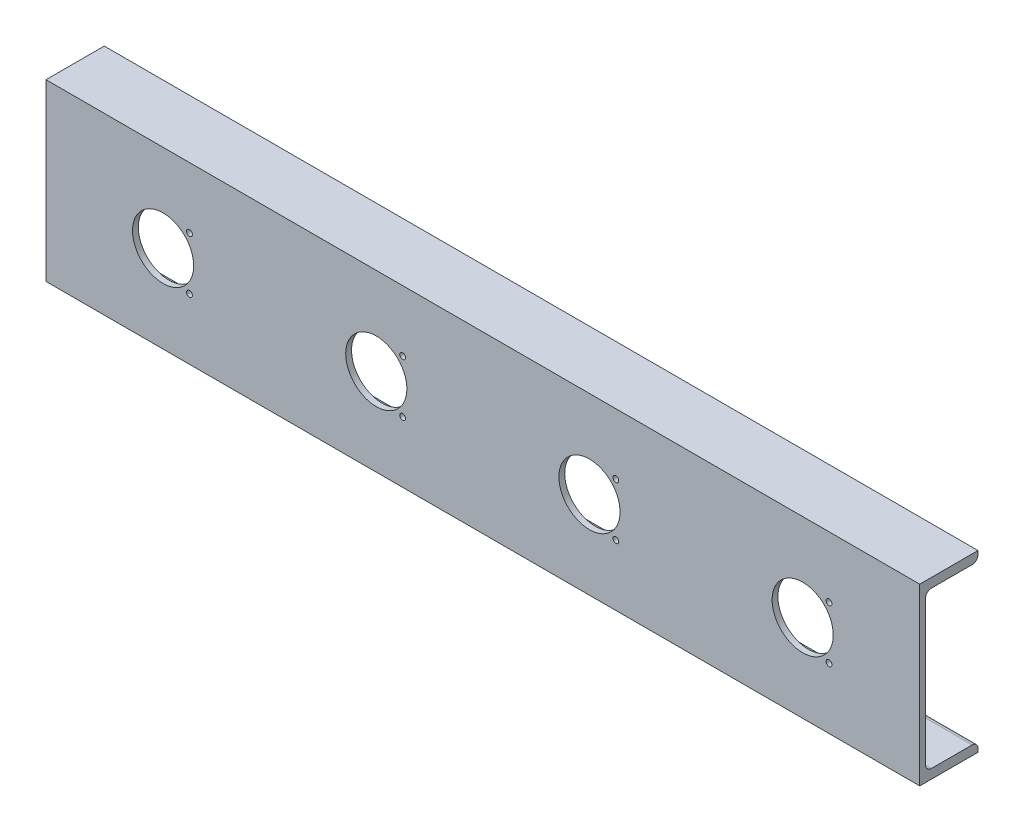
ISO-10303-21;
HEADER;
FILE_DESCRIPTION(('STEP AP214'),'2;1');
FILE_NAME('part.step','',(''),(''),'','','');
FILE_SCHEMA(('AUTOMOTIVE_DESIGN { 1 0 10303 214 1 1 1 1 }'));
ENDSEC;
DATA;
#1=APPLICATION_CONTEXT('core data for automotive mechanical design processes');
#2=APPLICATION_PROTOCOL_DEFINITION('international standard','automotive_design',2000,#1);
#3=PRODUCT_CONTEXT('',#1,'mechanical');
#4=PRODUCT('Part','Part','',(#3));
#5=PRODUCT_RELATED_PRODUCT_CATEGORY('part','',(#4));
#6=PRODUCT_DEFINITION_FORMATION('','',#4);
#7=PRODUCT_DEFINITION_CONTEXT('part definition',#1,'design');
#8=PRODUCT_DEFINITION('design','',#6,#7);
#9=PRODUCT_DEFINITION_SHAPE('','',#8);
#10=(LENGTH_UNIT() NAMED_UNIT(*) SI_UNIT(.MILLI.,.METRE.));
#11=(NAMED_UNIT(*) PLANE_ANGLE_UNIT() SI_UNIT($,.RADIAN.));
#12=(NAMED_UNIT(*) SI_UNIT($,.STERADIAN.) SOLID_ANGLE_UNIT());
#13=UNCERTAINTY_MEASURE_WITH_UNIT(LENGTH_MEASURE(1.E-05),#10,'distance_accuracy_value','');
#14=(GEOMETRIC_REPRESENTATION_CONTEXT(3) GLOBAL_UNCERTAINTY_ASSIGNED_CONTEXT((#13)) GLOBAL_UNIT_ASSIGNED_CONTEXT((#10,
#11,#12)) REPRESENTATION_CONTEXT('',''));
#15=CARTESIAN_POINT('',(0.,0.,0.));
#16=DIRECTION('',(0.,0.,1.));
#17=DIRECTION('',(1.,0.,0.));
#18=AXIS2_PLACEMENT_3D('',#15,#16,#17);
#19=CARTESIAN_POINT('',(201.,-36.1204013377926,206.622073578595));
#20=DIRECTION('',(0.,0.,-1.));
#21=DIRECTION('',(0.,1.,0.));
#22=AXIS2_PLACEMENT_3D('',#19,#20,#21);
#23=CYLINDRICAL_SURFACE('',#22,52.4999999999999);
#24=CARTESIAN_POINT('',(201.,-36.1204013377926,176.622073578595));
#25=DIRECTION('',(0.,0.,-1.));
#26=DIRECTION('',(0.,1.,0.));
#27=AXIS2_PLACEMENT_3D('',#24,#25,#26);
#28=CIRCLE('',#27,52.4999999999999);
#29=CARTESIAN_POINT('',(201.,16.3795986622073,176.622073578595));
#30=VERTEX_POINT('',#29);
#31=EDGE_CURVE('E43',#30,#30,#28,.T.);
#32=ORIENTED_EDGE('',*,*,#31,.T.);
#33=EDGE_LOOP('',(#32));
#34=FACE_BOUND('',#33,.T.);
#35=CARTESIAN_POINT('',(201.,-36.1204013377926,186.622073578595));
#36=DIRECTION('',(0.,0.,-1.));
#37=DIRECTION('',(-1.,0.,0.));
#38=AXIS2_PLACEMENT_3D('',#35,#36,#37);
#39=CIRCLE('',#38,52.4999999999999);
#40=CARTESIAN_POINT('',(148.5,-36.1204013377926,186.622073578595));
#41=VERTEX_POINT('',#40);
#42=EDGE_CURVE('E11',#41,#41,#39,.T.);
#43=ORIENTED_EDGE('',*,*,#42,.F.);
#44=EDGE_LOOP('',(#43));
#45=FACE_BOUND('',#44,.T.);
#46=ADVANCED_FACE('F34',(#34,#45),#23,.F.);
#47=CARTESIAN_POINT('',(567.,-36.1204013377926,206.622073578595));
#48=DIRECTION('',(0.,0.,-1.));
#49=DIRECTION('',(0.,1.,0.));
#50=AXIS2_PLACEMENT_3D('',#47,#48,#49);
#51=CYLINDRICAL_SURFACE('',#50,52.4999999999999);
#52=CARTESIAN_POINT('',(567.,-36.1204013377926,176.622073578595));
#53=DIRECTION('',(0.,0.,-1.));
#54=DIRECTION('',(0.,1.,0.));
#55=AXIS2_PLACEMENT_3D('',#52,#53,#54);
#56=CIRCLE('',#55,52.4999999999999);
#57=CARTESIAN_POINT('',(567.,16.3795986622073,176.622073578595));
#58=VERTEX_POINT('',#57);
#59=EDGE_CURVE('E207',#58,#58,#56,.T.);
#60=ORIENTED_EDGE('',*,*,#59,.T.);
#61=EDGE_LOOP('',(#60));
#62=FACE_BOUND('',#61,.T.);
#63=CARTESIAN_POINT('',(567.,-36.1204013377926,186.622073578595));
#64=DIRECTION('',(0.,0.,-1.));
#65=DIRECTION('',(-1.,0.,0.));
#66=AXIS2_PLACEMENT_3D('',#63,#64,#65);
#67=CIRCLE('',#66,52.4999999999999);
#68=CARTESIAN_POINT('',(514.5,-36.1204013377926,186.622073578595));
#69=VERTEX_POINT('',#68);
#70=EDGE_CURVE('E210',#69,#69,#67,.T.);
#71=ORIENTED_EDGE('',*,*,#70,.F.);
#72=EDGE_LOOP('',(#71));
#73=FACE_BOUND('',#72,.T.);
#74=ADVANCED_FACE('F313',(#62,#73),#51,.F.);
#75=CARTESIAN_POINT('',(1500.,107.879598662207,86.6220735785954));
#76=DIRECTION('',(0.,0.,1.));
#77=DIRECTION('',(1.,0.,0.));
#78=AXIS2_PLACEMENT_3D('',#75,#76,#77);
#79=PLANE('',#78);
#80=DIRECTION('',(0.,1.,0.));
#81=VECTOR('',#80,1.);
#82=CARTESIAN_POINT('',(0.,107.879598662207,86.6220735785954));
#83=LINE('',#82,#81);
#84=CARTESIAN_POINT('',(0.,107.879598662207,86.6220735785954));
#85=VERTEX_POINT('',#84);
#86=CARTESIAN_POINT('',(0.,113.879598662207,86.6220735785954));
#87=VERTEX_POINT('',#86);
#88=EDGE_CURVE('E157',#85,#87,#83,.T.);
#89=ORIENTED_EDGE('',*,*,#88,.T.);
#90=DIRECTION('',(-1.,0.,0.));
#91=VECTOR('',#90,1.);
#92=CARTESIAN_POINT('',(1500.,113.879598662207,86.6220735785954));
#93=LINE('',#92,#91);
#94=CARTESIAN_POINT('',(1500.,113.879598662207,86.6220735785954));
#95=VERTEX_POINT('',#94);
#96=EDGE_CURVE('E205',#95,#87,#93,.T.);
#97=ORIENTED_EDGE('',*,*,#96,.F.);
#98=DIRECTION('',(0.,1.,0.));
#99=VECTOR('',#98,1.);
#100=CARTESIAN_POINT('',(1500.,107.879598662207,86.6220735785954));
#101=LINE('',#100,#99);
#102=CARTESIAN_POINT('',(1500.,107.879598662207,86.6220735785954));
#103=VERTEX_POINT('',#102);
#104=EDGE_CURVE('E180',#103,#95,#101,.T.);
#105=ORIENTED_EDGE('',*,*,#104,.F.);
#106=DIRECTION('',(-1.,0.,0.));
#107=VECTOR('',#106,1.);
#108=CARTESIAN_POINT('',(1500.,107.879598662207,86.6220735785954));
#109=LINE('',#108,#107);
#110=EDGE_CURVE('E153',#103,#85,#109,.T.);
#111=ORIENTED_EDGE('',*,*,#110,.T.);
#112=EDGE_LOOP('',(#89,#97,#105,#111));
#113=FACE_BOUND('',#112,.T.);
#114=ADVANCED_FACE('F300',(#113),#79,.F.);
#115=CARTESIAN_POINT('',(1500.,113.879598662207,86.6220735785954));
#116=DIRECTION('',(0.,-1.,0.));
#117=DIRECTION('',(0.,0.,-1.));
#118=AXIS2_PLACEMENT_3D('',#115,#116,#117);
#119=PLANE('',#118);
#120=DIRECTION('',(0.,0.,1.));
#121=VECTOR('',#120,1.);
#122=CARTESIAN_POINT('',(0.,113.879598662207,86.6220735785954));
#123=LINE('',#122,#121);
#124=CARTESIAN_POINT('',(0.,113.879598662207,186.622073578595));
#125=VERTEX_POINT('',#124);
#126=EDGE_CURVE('E160',#87,#125,#123,.T.);
#127=ORIENTED_EDGE('',*,*,#126,.T.);
#128=DIRECTION('',(-1.,0.,0.));
#129=VECTOR('',#128,1.);
#130=CARTESIAN_POINT('',(1500.,113.879598662207,186.622073578595));
#131=LINE('',#130,#129);
#132=CARTESIAN_POINT('',(1500.,113.879598662207,186.622073578595));
#133=VERTEX_POINT('',#132);
#134=EDGE_CURVE('E202',#133,#125,#131,.T.);
#135=ORIENTED_EDGE('',*,*,#134,.F.);
#136=DIRECTION('',(0.,0.,1.));
#137=VECTOR('',#136,1.);
#138=CARTESIAN_POINT('',(1500.,113.879598662207,86.6220735785954));
#139=LINE('',#138,#137);
#140=EDGE_CURVE('E108',#95,#133,#139,.T.);
#141=ORIENTED_EDGE('',*,*,#140,.F.);
#142=ORIENTED_EDGE('',*,*,#96,.T.);
#143=EDGE_LOOP('',(#127,#135,#141,#142));
#144=FACE_BOUND('',#143,.T.);
#145=ADVANCED_FACE('F326',(#144),#119,.F.);
#146=CARTESIAN_POINT('',(1500.,113.879598662207,186.622073578595));
#147=DIRECTION('',(0.,0.,-1.));
#148=DIRECTION('',(-1.,0.,0.));
#149=AXIS2_PLACEMENT_3D('',#146,#147,#148);
#150=PLANE('',#149);
#151=CARTESIAN_POINT('',(246.254833995939,9.13443265814651,186.622073578595));
#152=DIRECTION('',(0.,0.,-1.));
#153=DIRECTION('',(-1.,0.,0.));
#154=AXIS2_PLACEMENT_3D('',#151,#152,#153);
#155=CIRCLE('',#154,4.99999999999982);
#156=CARTESIAN_POINT('',(241.254833995939,9.13443265814651,186.622073578595));
#157=VERTEX_POINT('',#156);
#158=EDGE_CURVE('E219',#157,#157,#155,.T.);
#159=ORIENTED_EDGE('',*,*,#158,.T.);
#160=EDGE_LOOP('',(#159));
#161=FACE_BOUND('',#160,.T.);
#162=CARTESIAN_POINT('',(612.254833995939,-81.3752353337317,186.622073578595));
#163=DIRECTION('',(0.,0.,-1.));
#164=DIRECTION('',(-1.,0.,0.));
#165=AXIS2_PLACEMENT_3D('',#162,#163,#164);
#166=CIRCLE('',#165,4.99999999999982);
#167=CARTESIAN_POINT('',(607.254833995939,-81.3752353337317,186.622073578595));
#168=VERTEX_POINT('',#167);
#169=EDGE_CURVE('E241',#168,#168,#166,.T.);
#170=ORIENTED_EDGE('',*,*,#169,.T.);
#171=EDGE_LOOP('',(#170));
#172=FACE_BOUND('',#171,.T.);
#173=CARTESIAN_POINT('',(612.254833995939,9.13443265814651,186.622073578595));
#174=DIRECTION('',(0.,0.,-1.));
#175=DIRECTION('',(-1.,0.,0.));
#176=AXIS2_PLACEMENT_3D('',#173,#174,#175);
#177=CIRCLE('',#176,4.99999999999982);
#178=CARTESIAN_POINT('',(607.254833995939,9.13443265814651,186.622073578595));
#179=VERTEX_POINT('',#178);
#180=EDGE_CURVE('E238',#179,#179,#177,.T.);
#181=ORIENTED_EDGE('',*,*,#180,.T.);
#182=EDGE_LOOP('',(#181));
#183=FACE_BOUND('',#182,.T.);
#184=CARTESIAN_POINT('',(978.254833995939,-81.3752353337317,186.622073578595));
#185=DIRECTION('',(0.,0.,-1.));
#186=DIRECTION('',(-1.,0.,0.));
#187=AXIS2_PLACEMENT_3D('',#184,#185,#186);
#188=CIRCLE('',#187,4.99999999999982);
#189=CARTESIAN_POINT('',(973.254833995939,-81.3752353337317,186.622073578595));
#190=VERTEX_POINT('',#189);
#191=EDGE_CURVE('E235',#190,#190,#188,.T.);
#192=ORIENTED_EDGE('',*,*,#191,.T.);
#193=EDGE_LOOP('',(#192));
#194=FACE_BOUND('',#193,.T.);
#195=CARTESIAN_POINT('',(246.254833995939,-81.3752353337317,186.622073578595));
#196=DIRECTION('',(0.,0.,-1.));
#197=DIRECTION('',(-1.,0.,0.));
#198=AXIS2_PLACEMENT_3D('',#195,#196,#197);
#199=CIRCLE('',#198,4.99999999999982);
#200=CARTESIAN_POINT('',(241.254833995939,-81.3752353337317,186.622073578595));
#201=VERTEX_POINT('',#200);
#202=EDGE_CURVE('E231',#201,#201,#199,.T.);
#203=ORIENTED_EDGE('',*,*,#202,.T.);
#204=EDGE_LOOP('',(#203));
#205=FACE_BOUND('',#204,.T.);
#206=CARTESIAN_POINT('',(978.254833995939,9.13443265814651,186.622073578595));
#207=DIRECTION('',(0.,0.,-1.));
#208=DIRECTION('',(-1.,0.,0.));
#209=AXIS2_PLACEMENT_3D('',#206,#207,#208);
#210=CIRCLE('',#209,4.99999999999982);
#211=CARTESIAN_POINT('',(973.254833995939,9.13443265814651,186.622073578595));
#212=VERTEX_POINT('',#211);
#213=EDGE_CURVE('E227',#212,#212,#210,.T.);
#214=ORIENTED_EDGE('',*,*,#213,.T.);
#215=EDGE_LOOP('',(#214));
#216=FACE_BOUND('',#215,.T.);
#217=CARTESIAN_POINT('',(1344.25483399594,9.13443265814651,186.622073578595));
#218=DIRECTION('',(0.,0.,-1.));
#219=DIRECTION('',(-1.,0.,0.));
#220=AXIS2_PLACEMENT_3D('',#217,#218,#219);
#221=CIRCLE('',#220,4.99999999999982);
#222=CARTESIAN_POINT('',(1339.25483399594,9.13443265814651,186.622073578595));
#223=VERTEX_POINT('',#222);
#224=EDGE_CURVE('E223',#223,#223,#221,.T.);
#225=ORIENTED_EDGE('',*,*,#224,.T.);
#226=EDGE_LOOP('',(#225));
#227=FACE_BOUND('',#226,.T.);
#228=CARTESIAN_POINT('',(1344.25483399594,-81.3752353337317,186.622073578595));
#229=DIRECTION('',(0.,0.,-1.));
#230=DIRECTION('',(-1.,0.,0.));
#231=AXIS2_PLACEMENT_3D('',#228,#229,#230);
#232=CIRCLE('',#231,4.99999999999982);
#233=CARTESIAN_POINT('',(1339.25483399594,-81.3752353337317,186.622073578595));
#234=VERTEX_POINT('',#233);
#235=EDGE_CURVE('E218',#234,#234,#232,.T.);
#236=ORIENTED_EDGE('',*,*,#235,.T.);
#237=EDGE_LOOP('',(#236));
#238=FACE_BOUND('',#237,.T.);
#239=CARTESIAN_POINT('',(933.,-36.1204013377926,186.622073578595));
#240=DIRECTION('',(0.,0.,-1.));
#241=DIRECTION('',(-1.,0.,0.));
#242=AXIS2_PLACEMENT_3D('',#239,#240,#241);
#243=CIRCLE('',#242,52.4999999999999);
#244=CARTESIAN_POINT('',(880.5,-36.1204013377926,186.622073578595));
#245=VERTEX_POINT('',#244);
#246=EDGE_CURVE('E262',#245,#245,#243,.T.);
#247=ORIENTED_EDGE('',*,*,#246,.T.);
#248=EDGE_LOOP('',(#247));
#249=FACE_BOUND('',#248,.T.);
#250=CARTESIAN_POINT('',(1299.,-36.1204013377926,186.622073578595));
#251=DIRECTION('',(0.,0.,-1.));
#252=DIRECTION('',(-1.,0.,0.));
#253=AXIS2_PLACEMENT_3D('',#250,#251,#252);
#254=CIRCLE('',#253,52.4999999999999);
#255=CARTESIAN_POINT('',(1246.5,-36.1204013377926,186.622073578595));
#256=VERTEX_POINT('',#255);
#257=EDGE_CURVE('E161',#256,#256,#254,.T.);
#258=ORIENTED_EDGE('',*,*,#257,.T.);
#259=EDGE_LOOP('',(#258));
#260=FACE_BOUND('',#259,.T.);
#261=DIRECTION('',(0.,-1.,0.));
#262=VECTOR('',#261,1.);
#263=CARTESIAN_POINT('',(0.,113.879598662207,186.622073578595));
#264=LINE('',#263,#262);
#265=CARTESIAN_POINT('',(0.,-186.120401337793,186.622073578595));
#266=VERTEX_POINT('',#265);
#267=EDGE_CURVE('E163',#125,#266,#264,.T.);
#268=ORIENTED_EDGE('',*,*,#267,.T.);
#269=DIRECTION('',(-1.,0.,0.));
#270=VECTOR('',#269,1.);
#271=CARTESIAN_POINT('',(1500.,-186.120401337793,186.622073578595));
#272=LINE('',#271,#270);
#273=CARTESIAN_POINT('',(1500.,-186.120401337793,186.622073578595));
#274=VERTEX_POINT('',#273);
#275=EDGE_CURVE('E199',#274,#266,#272,.T.);
#276=ORIENTED_EDGE('',*,*,#275,.F.);
#277=DIRECTION('',(0.,-1.,0.));
#278=VECTOR('',#277,1.);
#279=CARTESIAN_POINT('',(1500.,113.879598662207,186.622073578595));
#280=LINE('',#279,#278);
#281=EDGE_CURVE('E272',#133,#274,#280,.T.);
#282=ORIENTED_EDGE('',*,*,#281,.F.);
#283=ORIENTED_EDGE('',*,*,#134,.T.);
#284=EDGE_LOOP('',(#268,#276,#282,#283));
#285=FACE_BOUND('',#284,.T.);
#286=ORIENTED_EDGE('',*,*,#70,.T.);
#287=EDGE_LOOP('',(#286));
#288=FACE_BOUND('',#287,.T.);
#289=ORIENTED_EDGE('',*,*,#42,.T.);
#290=EDGE_LOOP('',(#289));
#291=FACE_BOUND('',#290,.T.);
#292=ADVANCED_FACE('F323',(#161,#172,#183,#194,#205,#216,#227,#238,#249,#260,#285,#288,#291),
#150,.F.);
#293=CARTESIAN_POINT('',(1500.,-186.120401337793,186.622073578595));
#294=DIRECTION('',(0.,1.,0.));
#295=DIRECTION('',(0.,0.,1.));
#296=AXIS2_PLACEMENT_3D('',#293,#294,#295);
#297=PLANE('',#296);
#298=DIRECTION('',(0.,0.,-1.));
#299=VECTOR('',#298,1.);
#300=CARTESIAN_POINT('',(0.,-186.120401337793,186.622073578595));
#301=LINE('',#300,#299);
#302=CARTESIAN_POINT('',(0.,-186.120401337793,86.6220735785954));
#303=VERTEX_POINT('',#302);
#304=EDGE_CURVE('E165',#266,#303,#301,.T.);
#305=ORIENTED_EDGE('',*,*,#304,.T.);
#306=DIRECTION('',(-1.,0.,0.));
#307=VECTOR('',#306,1.);
#308=CARTESIAN_POINT('',(1500.,-186.120401337793,86.6220735785954));
#309=LINE('',#308,#307);
#310=CARTESIAN_POINT('',(1500.,-186.120401337793,86.6220735785954));
#311=VERTEX_POINT('',#310);
#312=EDGE_CURVE('E196',#311,#303,#309,.T.);
#313=ORIENTED_EDGE('',*,*,#312,.F.);
#314=DIRECTION('',(0.,0.,-1.));
#315=VECTOR('',#314,1.);
#316=CARTESIAN_POINT('',(1500.,-186.120401337793,186.622073578595));
#317=LINE('',#316,#315);
#318=EDGE_CURVE('E274',#274,#311,#317,.T.);
#319=ORIENTED_EDGE('',*,*,#318,.F.);
#320=ORIENTED_EDGE('',*,*,#275,.T.);
#321=EDGE_LOOP('',(#305,#313,#319,#320));
#322=FACE_BOUND('',#321,.T.);
#323=ADVANCED_FACE('F325',(#322),#297,.F.);
#324=CARTESIAN_POINT('',(1500.,-186.120401337793,86.6220735785954));
#325=DIRECTION('',(0.,0.,1.));
#326=DIRECTION('',(1.,0.,0.));
#327=AXIS2_PLACEMENT_3D('',#324,#325,#326);
#328=PLANE('',#327);
#329=DIRECTION('',(0.,1.,0.));
#330=VECTOR('',#329,1.);
#331=CARTESIAN_POINT('',(0.,-186.120401337793,86.6220735785954));
#332=LINE('',#331,#330);
#333=CARTESIAN_POINT('',(0.,-180.120401337793,86.6220735785954));
#334=VERTEX_POINT('',#333);
#335=EDGE_CURVE('E167',#303,#334,#332,.T.);
#336=ORIENTED_EDGE('',*,*,#335,.T.);
#337=DIRECTION('',(-1.,0.,0.));
#338=VECTOR('',#337,1.);
#339=CARTESIAN_POINT('',(1500.,-180.120401337793,86.6220735785954));
#340=LINE('',#339,#338);
#341=CARTESIAN_POINT('',(1500.,-180.120401337793,86.6220735785954));
#342=VERTEX_POINT('',#341);
#343=EDGE_CURVE('E193',#342,#334,#340,.T.);
#344=ORIENTED_EDGE('',*,*,#343,.F.);
#345=DIRECTION('',(0.,1.,0.));
#346=VECTOR('',#345,1.);
#347=CARTESIAN_POINT('',(1500.,-186.120401337793,86.6220735785954));
#348=LINE('',#347,#346);
#349=EDGE_CURVE('E276',#311,#342,#348,.T.);
#350=ORIENTED_EDGE('',*,*,#349,.F.);
#351=ORIENTED_EDGE('',*,*,#312,.T.);
#352=EDGE_LOOP('',(#336,#344,#350,#351));
#353=FACE_BOUND('',#352,.T.);
#354=ADVANCED_FACE('F334',(#353),#328,.F.);
#355=CARTESIAN_POINT('',(1500.,-180.120401337793,96.6220735785954));
#356=DIRECTION('',(-1.,0.,0.));
#357=DIRECTION('',(0.,0.,1.));
#358=AXIS2_PLACEMENT_3D('',#355,#356,#357);
#359=CYLINDRICAL_SURFACE('',#358,10.);
#360=CARTESIAN_POINT('',(0.,-180.120401337793,96.6220735785954));
#361=DIRECTION('',(1.,0.,0.));
#362=DIRECTION('',(0.,0.,-1.));
#363=AXIS2_PLACEMENT_3D('',#360,#361,#362);
#364=CIRCLE('',#363,10.);
#365=CARTESIAN_POINT('',(0.,-170.120401337793,96.6220735785954));
#366=VERTEX_POINT('',#365);
#367=EDGE_CURVE('E169',#334,#366,#364,.T.);
#368=ORIENTED_EDGE('',*,*,#367,.T.);
#369=DIRECTION('',(-1.,0.,0.));
#370=VECTOR('',#369,1.);
#371=CARTESIAN_POINT('',(1500.,-170.120401337793,96.6220735785954));
#372=LINE('',#371,#370);
#373=CARTESIAN_POINT('',(1500.,-170.120401337793,96.6220735785954));
#374=VERTEX_POINT('',#373);
#375=EDGE_CURVE('E190',#374,#366,#372,.T.);
#376=ORIENTED_EDGE('',*,*,#375,.F.);
#377=CARTESIAN_POINT('',(1500.,-180.120401337793,96.6220735785954));
#378=DIRECTION('',(1.,0.,0.));
#379=DIRECTION('',(0.,0.,-1.));
#380=AXIS2_PLACEMENT_3D('',#377,#378,#379);
#381=CIRCLE('',#380,10.);
#382=EDGE_CURVE('E278',#342,#374,#381,.T.);
#383=ORIENTED_EDGE('',*,*,#382,.F.);
#384=ORIENTED_EDGE('',*,*,#343,.T.);
#385=EDGE_LOOP('',(#368,#376,#383,#384));
#386=FACE_BOUND('',#385,.T.);
#387=ADVANCED_FACE('F366',(#386),#359,.T.);
#388=CARTESIAN_POINT('',(1500.,-170.120401337793,96.6220735785954));
#389=DIRECTION('',(0.,-1.,0.));
#390=DIRECTION('',(0.,0.,-1.));
#391=AXIS2_PLACEMENT_3D('',#388,#389,#390);
#392=PLANE('',#391);
#393=DIRECTION('',(0.,0.,1.));
#394=VECTOR('',#393,1.);
#395=CARTESIAN_POINT('',(0.,-170.120401337793,96.6220735785954));
#396=LINE('',#395,#394);
#397=CARTESIAN_POINT('',(0.,-170.120401337793,166.622073578595));
#398=VERTEX_POINT('',#397);
#399=EDGE_CURVE('E171',#366,#398,#396,.T.);
#400=ORIENTED_EDGE('',*,*,#399,.T.);
#401=DIRECTION('',(-1.,0.,0.));
#402=VECTOR('',#401,1.);
#403=CARTESIAN_POINT('',(1500.,-170.120401337793,166.622073578595));
#404=LINE('',#403,#402);
#405=CARTESIAN_POINT('',(1500.,-170.120401337793,166.622073578595));
#406=VERTEX_POINT('',#405);
#407=EDGE_CURVE('E187',#406,#398,#404,.T.);
#408=ORIENTED_EDGE('',*,*,#407,.F.);
#409=DIRECTION('',(0.,0.,1.));
#410=VECTOR('',#409,1.);
#411=CARTESIAN_POINT('',(1500.,-170.120401337793,96.6220735785954));
#412=LINE('',#411,#410);
#413=EDGE_CURVE('E280',#374,#406,#412,.T.);
#414=ORIENTED_EDGE('',*,*,#413,.F.);
#415=ORIENTED_EDGE('',*,*,#375,.T.);
#416=EDGE_LOOP('',(#400,#408,#414,#415));
#417=FACE_BOUND('',#416,.T.);
#418=ADVANCED_FACE('F373',(#417),#392,.F.);
#419=CARTESIAN_POINT('',(1500.,-160.120401337793,166.622073578595));
#420=DIRECTION('',(-1.,0.,0.));
#421=DIRECTION('',(0.,0.,1.));
#422=AXIS2_PLACEMENT_3D('',#419,#420,#421);
#423=CYLINDRICAL_SURFACE('',#422,10.);
#424=CARTESIAN_POINT('',(0.,-160.120401337793,166.622073578595));
#425=DIRECTION('',(-1.,0.,0.));
#426=DIRECTION('',(0.,0.,1.));
#427=AXIS2_PLACEMENT_3D('',#424,#425,#426);
#428=CIRCLE('',#427,10.);
#429=CARTESIAN_POINT('',(0.,-160.120401337793,176.622073578595));
#430=VERTEX_POINT('',#429);
#431=EDGE_CURVE('E173',#398,#430,#428,.T.);
#432=ORIENTED_EDGE('',*,*,#431,.T.);
#433=DIRECTION('',(-1.,0.,0.));
#434=VECTOR('',#433,1.);
#435=CARTESIAN_POINT('',(1500.,-160.120401337793,176.622073578595));
#436=LINE('',#435,#434);
#437=CARTESIAN_POINT('',(1500.,-160.120401337793,176.622073578595));
#438=VERTEX_POINT('',#437);
#439=EDGE_CURVE('E184',#438,#430,#436,.T.);
#440=ORIENTED_EDGE('',*,*,#439,.F.);
#441=CARTESIAN_POINT('',(1500.,-160.120401337793,166.622073578595));
#442=DIRECTION('',(-1.,0.,0.));
#443=DIRECTION('',(0.,0.,1.));
#444=AXIS2_PLACEMENT_3D('',#441,#442,#443);
#445=CIRCLE('',#444,10.);
#446=EDGE_CURVE('E282',#406,#438,#445,.T.);
#447=ORIENTED_EDGE('',*,*,#446,.F.);
#448=ORIENTED_EDGE('',*,*,#407,.T.);
#449=EDGE_LOOP('',(#432,#440,#447,#448));
#450=FACE_BOUND('',#449,.T.);
#451=ADVANCED_FACE('F288',(#450),#423,.F.);
#452=CARTESIAN_POINT('',(1500.,-160.120401337793,176.622073578595));
#453=DIRECTION('',(0.,0.,1.));
#454=DIRECTION('',(0.,-1.,0.));
#455=AXIS2_PLACEMENT_3D('',#452,#453,#454);
#456=PLANE('',#455);
#457=CARTESIAN_POINT('',(246.254833995939,9.13443265814651,176.622073578595));
#458=DIRECTION('',(0.,0.,1.));
#459=DIRECTION('',(0.,-1.,0.));
#460=AXIS2_PLACEMENT_3D('',#457,#458,#459);
#461=CIRCLE('',#460,4.99999999999982);
#462=CARTESIAN_POINT('',(246.254833995939,4.13443265814669,176.622073578595));
#463=VERTEX_POINT('',#462);
#464=EDGE_CURVE('E37',#463,#463,#461,.T.);
#465=ORIENTED_EDGE('',*,*,#464,.T.);
#466=EDGE_LOOP('',(#465));
#467=FACE_BOUND('',#466,.T.);
#468=CARTESIAN_POINT('',(612.254833995939,-81.3752353337317,176.622073578595));
#469=DIRECTION('',(0.,0.,1.));
#470=DIRECTION('',(0.,-1.,0.));
#471=AXIS2_PLACEMENT_3D('',#468,#469,#470);
#472=CIRCLE('',#471,4.99999999999982);
#473=CARTESIAN_POINT('',(612.254833995939,-86.3752353337315,176.622073578595));
#474=VERTEX_POINT('',#473);
#475=EDGE_CURVE('E239',#474,#474,#472,.T.);
#476=ORIENTED_EDGE('',*,*,#475,.T.);
#477=EDGE_LOOP('',(#476));
#478=FACE_BOUND('',#477,.T.);
#479=CARTESIAN_POINT('',(612.254833995939,9.13443265814651,176.622073578595));
#480=DIRECTION('',(0.,0.,1.));
#481=DIRECTION('',(0.,-1.,0.));
#482=AXIS2_PLACEMENT_3D('',#479,#480,#481);
#483=CIRCLE('',#482,4.99999999999982);
#484=CARTESIAN_POINT('',(612.254833995939,4.13443265814669,176.622073578595));
#485=VERTEX_POINT('',#484);
#486=EDGE_CURVE('E236',#485,#485,#483,.T.);
#487=ORIENTED_EDGE('',*,*,#486,.T.);
#488=EDGE_LOOP('',(#487));
#489=FACE_BOUND('',#488,.T.);
#490=CARTESIAN_POINT('',(978.254833995939,-81.3752353337317,176.622073578595));
#491=DIRECTION('',(0.,0.,1.));
#492=DIRECTION('',(0.,-1.,0.));
#493=AXIS2_PLACEMENT_3D('',#490,#491,#492);
#494=CIRCLE('',#493,4.99999999999982);
#495=CARTESIAN_POINT('',(978.254833995939,-86.3752353337315,176.622073578595));
#496=VERTEX_POINT('',#495);
#497=EDGE_CURVE('E232',#496,#496,#494,.T.);
#498=ORIENTED_EDGE('',*,*,#497,.T.);
#499=EDGE_LOOP('',(#498));
#500=FACE_BOUND('',#499,.T.);
#501=CARTESIAN_POINT('',(246.254833995939,-81.3752353337317,176.622073578595));
#502=DIRECTION('',(0.,0.,1.));
#503=DIRECTION('',(0.,-1.,0.));
#504=AXIS2_PLACEMENT_3D('',#501,#502,#503);
#505=CIRCLE('',#504,4.99999999999982);
#506=CARTESIAN_POINT('',(246.254833995939,-86.3752353337315,176.622073578595));
#507=VERTEX_POINT('',#506);
#508=EDGE_CURVE('E228',#507,#507,#505,.T.);
#509=ORIENTED_EDGE('',*,*,#508,.T.);
#510=EDGE_LOOP('',(#509));
#511=FACE_BOUND('',#510,.T.);
#512=CARTESIAN_POINT('',(978.254833995939,9.13443265814651,176.622073578595));
#513=DIRECTION('',(0.,0.,1.));
#514=DIRECTION('',(0.,-1.,0.));
#515=AXIS2_PLACEMENT_3D('',#512,#513,#514);
#516=CIRCLE('',#515,4.99999999999982);
#517=CARTESIAN_POINT('',(978.254833995939,4.13443265814669,176.622073578595));
#518=VERTEX_POINT('',#517);
#519=EDGE_CURVE('E224',#518,#518,#516,.T.);
#520=ORIENTED_EDGE('',*,*,#519,.T.);
#521=EDGE_LOOP('',(#520));
#522=FACE_BOUND('',#521,.T.);
#523=CARTESIAN_POINT('',(1344.25483399594,9.13443265814651,176.622073578595));
#524=DIRECTION('',(0.,0.,1.));
#525=DIRECTION('',(0.,-1.,0.));
#526=AXIS2_PLACEMENT_3D('',#523,#524,#525);
#527=CIRCLE('',#526,4.99999999999982);
#528=CARTESIAN_POINT('',(1344.25483399594,4.13443265814669,176.622073578595));
#529=VERTEX_POINT('',#528);
#530=EDGE_CURVE('E220',#529,#529,#527,.T.);
#531=ORIENTED_EDGE('',*,*,#530,.T.);
#532=EDGE_LOOP('',(#531));
#533=FACE_BOUND('',#532,.T.);
#534=CARTESIAN_POINT('',(1344.25483399594,-81.3752353337317,176.622073578595));
#535=DIRECTION('',(0.,0.,1.));
#536=DIRECTION('',(0.,-1.,0.));
#537=AXIS2_PLACEMENT_3D('',#534,#535,#536);
#538=CIRCLE('',#537,4.99999999999982);
#539=CARTESIAN_POINT('',(1344.25483399594,-86.3752353337315,176.622073578595));
#540=VERTEX_POINT('',#539);
#541=EDGE_CURVE('E215',#540,#540,#538,.T.);
#542=ORIENTED_EDGE('',*,*,#541,.T.);
#543=EDGE_LOOP('',(#542));
#544=FACE_BOUND('',#543,.T.);
#545=CARTESIAN_POINT('',(933.,-36.1204013377926,176.622073578595));
#546=DIRECTION('',(0.,0.,-1.));
#547=DIRECTION('',(0.,1.,0.));
#548=AXIS2_PLACEMENT_3D('',#545,#546,#547);
#549=CIRCLE('',#548,52.4999999999999);
#550=CARTESIAN_POINT('',(933.,16.3795986622073,176.622073578595));
#551=VERTEX_POINT('',#550);
#552=EDGE_CURVE('E259',#551,#551,#549,.T.);
#553=ORIENTED_EDGE('',*,*,#552,.F.);
#554=EDGE_LOOP('',(#553));
#555=FACE_BOUND('',#554,.T.);
#556=CARTESIAN_POINT('',(1299.,-36.1204013377926,176.622073578595));
#557=DIRECTION('',(0.,0.,-1.));
#558=DIRECTION('',(0.,1.,0.));
#559=AXIS2_PLACEMENT_3D('',#556,#557,#558);
#560=CIRCLE('',#559,52.4999999999999);
#561=CARTESIAN_POINT('',(1299.,16.3795986622073,176.622073578595));
#562=VERTEX_POINT('',#561);
#563=EDGE_CURVE('E265',#562,#562,#560,.T.);
#564=ORIENTED_EDGE('',*,*,#563,.F.);
#565=EDGE_LOOP('',(#564));
#566=FACE_BOUND('',#565,.T.);
#567=DIRECTION('',(0.,1.,0.));
#568=VECTOR('',#567,1.);
#569=CARTESIAN_POINT('',(0.,-160.120401337793,176.622073578595));
#570=LINE('',#569,#568);
#571=CARTESIAN_POINT('',(0.,87.8795986622073,176.622073578595));
#572=VERTEX_POINT('',#571);
#573=EDGE_CURVE('E175',#430,#572,#570,.T.);
#574=ORIENTED_EDGE('',*,*,#573,.T.);
#575=DIRECTION('',(-1.,0.,0.));
#576=VECTOR('',#575,1.);
#577=CARTESIAN_POINT('',(1500.,87.8795986622073,176.622073578595));
#578=LINE('',#577,#576);
#579=CARTESIAN_POINT('',(1500.,87.8795986622073,176.622073578595));
#580=VERTEX_POINT('',#579);
#581=EDGE_CURVE('E148',#580,#572,#578,.T.);
#582=ORIENTED_EDGE('',*,*,#581,.F.);
#583=DIRECTION('',(0.,1.,0.));
#584=VECTOR('',#583,1.);
#585=CARTESIAN_POINT('',(1500.,-160.120401337793,176.622073578595));
#586=LINE('',#585,#584);
#587=EDGE_CURVE('E139',#438,#580,#586,.T.);
#588=ORIENTED_EDGE('',*,*,#587,.F.);
#589=ORIENTED_EDGE('',*,*,#439,.T.);
#590=EDGE_LOOP('',(#574,#582,#588,#589));
#591=FACE_BOUND('',#590,.T.);
#592=ORIENTED_EDGE('',*,*,#59,.F.);
#593=EDGE_LOOP('',(#592));
#594=FACE_BOUND('',#593,.T.);
#595=ORIENTED_EDGE('',*,*,#31,.F.);
#596=EDGE_LOOP('',(#595));
#597=FACE_BOUND('',#596,.T.);
#598=ADVANCED_FACE('F292',(#467,#478,#489,#500,#511,#522,#533,#544,#555,#566,#591,#594,#597),
#456,.F.);
#599=CARTESIAN_POINT('',(1500.,87.8795986622074,166.622073578595));
#600=DIRECTION('',(-1.,0.,0.));
#601=DIRECTION('',(0.,0.,1.));
#602=AXIS2_PLACEMENT_3D('',#599,#600,#601);
#603=CYLINDRICAL_SURFACE('',#602,10.);
#604=CARTESIAN_POINT('',(0.,87.8795986622074,166.622073578595));
#605=DIRECTION('',(-1.,0.,0.));
#606=DIRECTION('',(0.,0.,1.));
#607=AXIS2_PLACEMENT_3D('',#604,#605,#606);
#608=CIRCLE('',#607,10.);
#609=CARTESIAN_POINT('',(0.,97.8795986622074,166.622073578595));
#610=VERTEX_POINT('',#609);
#611=EDGE_CURVE('E147',#572,#610,#608,.T.);
#612=ORIENTED_EDGE('',*,*,#611,.T.);
#613=DIRECTION('',(-1.,0.,0.));
#614=VECTOR('',#613,1.);
#615=CARTESIAN_POINT('',(1500.,97.8795986622074,166.622073578595));
#616=LINE('',#615,#614);
#617=CARTESIAN_POINT('',(1500.,97.8795986622074,166.622073578595));
#618=VERTEX_POINT('',#617);
#619=EDGE_CURVE('E144',#618,#610,#616,.T.);
#620=ORIENTED_EDGE('',*,*,#619,.F.);
#621=CARTESIAN_POINT('',(1500.,87.8795986622074,166.622073578595));
#622=DIRECTION('',(-1.,0.,0.));
#623=DIRECTION('',(0.,0.,1.));
#624=AXIS2_PLACEMENT_3D('',#621,#622,#623);
#625=CIRCLE('',#624,10.);
#626=EDGE_CURVE('E133',#580,#618,#625,.T.);
#627=ORIENTED_EDGE('',*,*,#626,.F.);
#628=ORIENTED_EDGE('',*,*,#581,.T.);
#629=EDGE_LOOP('',(#612,#620,#627,#628));
#630=FACE_BOUND('',#629,.T.);
#631=ADVANCED_FACE('F145',(#630),#603,.F.);
#632=CARTESIAN_POINT('',(1500.,97.8795986622074,166.622073578595));
#633=DIRECTION('',(0.,1.,0.));
#634=DIRECTION('',(0.,0.,1.));
#635=AXIS2_PLACEMENT_3D('',#632,#633,#634);
#636=PLANE('',#635);
#637=DIRECTION('',(0.,0.,-1.));
#638=VECTOR('',#637,1.);
#639=CARTESIAN_POINT('',(0.,97.8795986622074,166.622073578595));
#640=LINE('',#639,#638);
#641=CARTESIAN_POINT('',(0.,97.8795986622074,96.6220735785955));
#642=VERTEX_POINT('',#641);
#643=EDGE_CURVE('E93',#610,#642,#640,.T.);
#644=ORIENTED_EDGE('',*,*,#643,.T.);
#645=DIRECTION('',(-1.,0.,0.));
#646=VECTOR('',#645,1.);
#647=CARTESIAN_POINT('',(1500.,97.8795986622074,96.6220735785955));
#648=LINE('',#647,#646);
#649=CARTESIAN_POINT('',(1500.,97.8795986622074,96.6220735785955));
#650=VERTEX_POINT('',#649);
#651=EDGE_CURVE('E149',#650,#642,#648,.T.);
#652=ORIENTED_EDGE('',*,*,#651,.F.);
#653=DIRECTION('',(0.,0.,-1.));
#654=VECTOR('',#653,1.);
#655=CARTESIAN_POINT('',(1500.,97.8795986622074,166.622073578595));
#656=LINE('',#655,#654);
#657=EDGE_CURVE('E137',#618,#650,#656,.T.);
#658=ORIENTED_EDGE('',*,*,#657,.F.);
#659=ORIENTED_EDGE('',*,*,#619,.T.);
#660=EDGE_LOOP('',(#644,#652,#658,#659));
#661=FACE_BOUND('',#660,.T.);
#662=ADVANCED_FACE('F151',(#661),#636,.F.);
#663=CARTESIAN_POINT('',(1500.,107.879598662207,96.6220735785954));
#664=DIRECTION('',(-1.,0.,0.));
#665=DIRECTION('',(0.,0.,1.));
#666=AXIS2_PLACEMENT_3D('',#663,#664,#665);
#667=CYLINDRICAL_SURFACE('',#666,9.99999999999999);
#668=CARTESIAN_POINT('',(0.,107.879598662207,96.6220735785954));
#669=DIRECTION('',(1.,0.,0.));
#670=DIRECTION('',(0.,0.,-1.));
#671=AXIS2_PLACEMENT_3D('',#668,#669,#670);
#672=CIRCLE('',#671,9.99999999999999);
#673=EDGE_CURVE('E99',#642,#85,#672,.T.);
#674=ORIENTED_EDGE('',*,*,#673,.T.);
#675=ORIENTED_EDGE('',*,*,#110,.F.);
#676=CARTESIAN_POINT('',(1500.,107.879598662207,96.6220735785954));
#677=DIRECTION('',(1.,0.,0.));
#678=DIRECTION('',(0.,0.,-1.));
#679=AXIS2_PLACEMENT_3D('',#676,#677,#678);
#680=CIRCLE('',#679,9.99999999999999);
#681=EDGE_CURVE('E52',#650,#103,#680,.T.);
#682=ORIENTED_EDGE('',*,*,#681,.F.);
#683=ORIENTED_EDGE('',*,*,#651,.T.);
#684=EDGE_LOOP('',(#674,#675,#682,#683));
#685=FACE_BOUND('',#684,.T.);
#686=ADVANCED_FACE('F302',(#685),#667,.T.);
#687=CARTESIAN_POINT('',(1500.,-180.120401337793,96.6220735785954));
#688=DIRECTION('',(1.,0.,0.));
#689=DIRECTION('',(0.,0.,-1.));
#690=AXIS2_PLACEMENT_3D('',#687,#688,#689);
#691=PLANE('',#690);
#692=ORIENTED_EDGE('',*,*,#104,.T.);
#693=ORIENTED_EDGE('',*,*,#140,.T.);
#694=ORIENTED_EDGE('',*,*,#281,.T.);
#695=ORIENTED_EDGE('',*,*,#318,.T.);
#696=ORIENTED_EDGE('',*,*,#349,.T.);
#697=ORIENTED_EDGE('',*,*,#382,.T.);
#698=ORIENTED_EDGE('',*,*,#413,.T.);
#699=ORIENTED_EDGE('',*,*,#446,.T.);
#700=ORIENTED_EDGE('',*,*,#587,.T.);
#701=ORIENTED_EDGE('',*,*,#626,.T.);
#702=ORIENTED_EDGE('',*,*,#657,.T.);
#703=ORIENTED_EDGE('',*,*,#681,.T.);
#704=EDGE_LOOP('',(#692,#693,#694,#695,#696,#697,#698,#699,#700,#701,#702,#703));
#705=FACE_BOUND('',#704,.T.);
#706=ADVANCED_FACE('F135',(#705),#691,.T.);
#707=CARTESIAN_POINT('',(0.,-180.120401337793,96.6220735785954));
#708=DIRECTION('',(1.,0.,0.));
#709=DIRECTION('',(0.,0.,-1.));
#710=AXIS2_PLACEMENT_3D('',#707,#708,#709);
#711=PLANE('',#710);
#712=ORIENTED_EDGE('',*,*,#88,.F.);
#713=ORIENTED_EDGE('',*,*,#673,.F.);
#714=ORIENTED_EDGE('',*,*,#643,.F.);
#715=ORIENTED_EDGE('',*,*,#611,.F.);
#716=ORIENTED_EDGE('',*,*,#573,.F.);
#717=ORIENTED_EDGE('',*,*,#431,.F.);
#718=ORIENTED_EDGE('',*,*,#399,.F.);
#719=ORIENTED_EDGE('',*,*,#367,.F.);
#720=ORIENTED_EDGE('',*,*,#335,.F.);
#721=ORIENTED_EDGE('',*,*,#304,.F.);
#722=ORIENTED_EDGE('',*,*,#267,.F.);
#723=ORIENTED_EDGE('',*,*,#126,.F.);
#724=EDGE_LOOP('',(#712,#713,#714,#715,#716,#717,#718,#719,#720,#721,#722,#723));
#725=FACE_BOUND('',#724,.T.);
#726=ADVANCED_FACE('F296',(#725),#711,.F.);
#727=CARTESIAN_POINT('',(1299.,-36.1204013377926,206.622073578595));
#728=DIRECTION('',(0.,0.,-1.));
#729=DIRECTION('',(0.,1.,0.));
#730=AXIS2_PLACEMENT_3D('',#727,#728,#729);
#731=CYLINDRICAL_SURFACE('',#730,52.4999999999999);
#732=ORIENTED_EDGE('',*,*,#563,.T.);
#733=EDGE_LOOP('',(#732));
#734=FACE_BOUND('',#733,.T.);
#735=ORIENTED_EDGE('',*,*,#257,.F.);
#736=EDGE_LOOP('',(#735));
#737=FACE_BOUND('',#736,.T.);
#738=ADVANCED_FACE('F426',(#734,#737),#731,.F.);
#739=CARTESIAN_POINT('',(933.,-36.1204013377926,206.622073578595));
#740=DIRECTION('',(0.,0.,-1.));
#741=DIRECTION('',(0.,1.,0.));
#742=AXIS2_PLACEMENT_3D('',#739,#740,#741);
#743=CYLINDRICAL_SURFACE('',#742,52.4999999999999);
#744=ORIENTED_EDGE('',*,*,#552,.T.);
#745=EDGE_LOOP('',(#744));
#746=FACE_BOUND('',#745,.T.);
#747=ORIENTED_EDGE('',*,*,#246,.F.);
#748=EDGE_LOOP('',(#747));
#749=FACE_BOUND('',#748,.T.);
#750=ADVANCED_FACE('F433',(#746,#749),#743,.F.);
#751=CARTESIAN_POINT('',(1344.25483399594,-81.3752353337317,86.6220735785954));
#752=DIRECTION('',(0.,0.,1.));
#753=DIRECTION('',(1.,0.,0.));
#754=AXIS2_PLACEMENT_3D('',#751,#752,#753);
#755=CYLINDRICAL_SURFACE('',#754,4.99999999999982);
#756=ORIENTED_EDGE('',*,*,#541,.F.);
#757=EDGE_LOOP('',(#756));
#758=FACE_BOUND('',#757,.T.);
#759=ORIENTED_EDGE('',*,*,#235,.F.);
#760=EDGE_LOOP('',(#759));
#761=FACE_BOUND('',#760,.T.);
#762=ADVANCED_FACE('F452',(#758,#761),#755,.F.);
#763=CARTESIAN_POINT('',(1344.25483399594,9.13443265814651,86.6220735785954));
#764=DIRECTION('',(0.,0.,1.));
#765=DIRECTION('',(1.,0.,0.));
#766=AXIS2_PLACEMENT_3D('',#763,#764,#765);
#767=CYLINDRICAL_SURFACE('',#766,4.99999999999982);
#768=ORIENTED_EDGE('',*,*,#530,.F.);
#769=EDGE_LOOP('',(#768));
#770=FACE_BOUND('',#769,.T.);
#771=ORIENTED_EDGE('',*,*,#224,.F.);
#772=EDGE_LOOP('',(#771));
#773=FACE_BOUND('',#772,.T.);
#774=ADVANCED_FACE('F461',(#770,#773),#767,.F.);
#775=CARTESIAN_POINT('',(978.254833995939,9.13443265814651,86.6220735785954));
#776=DIRECTION('',(0.,0.,1.));
#777=DIRECTION('',(1.,0.,0.));
#778=AXIS2_PLACEMENT_3D('',#775,#776,#777);
#779=CYLINDRICAL_SURFACE('',#778,4.99999999999982);
#780=ORIENTED_EDGE('',*,*,#519,.F.);
#781=EDGE_LOOP('',(#780));
#782=FACE_BOUND('',#781,.T.);
#783=ORIENTED_EDGE('',*,*,#213,.F.);
#784=EDGE_LOOP('',(#783));
#785=FACE_BOUND('',#784,.T.);
#786=ADVANCED_FACE('F470',(#782,#785),#779,.F.);
#787=CARTESIAN_POINT('',(246.254833995939,-81.3752353337317,86.6220735785954));
#788=DIRECTION('',(0.,0.,1.));
#789=DIRECTION('',(1.,0.,0.));
#790=AXIS2_PLACEMENT_3D('',#787,#788,#789);
#791=CYLINDRICAL_SURFACE('',#790,4.99999999999982);
#792=ORIENTED_EDGE('',*,*,#508,.F.);
#793=EDGE_LOOP('',(#792));
#794=FACE_BOUND('',#793,.T.);
#795=ORIENTED_EDGE('',*,*,#202,.F.);
#796=EDGE_LOOP('',(#795));
#797=FACE_BOUND('',#796,.T.);
#798=ADVANCED_FACE('F480',(#794,#797),#791,.F.);
#799=CARTESIAN_POINT('',(978.254833995939,-81.3752353337317,86.6220735785954));
#800=DIRECTION('',(0.,0.,1.));
#801=DIRECTION('',(1.,0.,0.));
#802=AXIS2_PLACEMENT_3D('',#799,#800,#801);
#803=CYLINDRICAL_SURFACE('',#802,4.99999999999982);
#804=ORIENTED_EDGE('',*,*,#497,.F.);
#805=EDGE_LOOP('',(#804));
#806=FACE_BOUND('',#805,.T.);
#807=ORIENTED_EDGE('',*,*,#191,.F.);
#808=EDGE_LOOP('',(#807));
#809=FACE_BOUND('',#808,.T.);
#810=ADVANCED_FACE('F487',(#806,#809),#803,.F.);
#811=CARTESIAN_POINT('',(612.254833995939,9.13443265814651,86.6220735785954));
#812=DIRECTION('',(0.,0.,1.));
#813=DIRECTION('',(1.,0.,0.));
#814=AXIS2_PLACEMENT_3D('',#811,#812,#813);
#815=CYLINDRICAL_SURFACE('',#814,4.99999999999982);
#816=ORIENTED_EDGE('',*,*,#486,.F.);
#817=EDGE_LOOP('',(#816));
#818=FACE_BOUND('',#817,.T.);
#819=ORIENTED_EDGE('',*,*,#180,.F.);
#820=EDGE_LOOP('',(#819));
#821=FACE_BOUND('',#820,.T.);
#822=ADVANCED_FACE('F495',(#818,#821),#815,.F.);
#823=CARTESIAN_POINT('',(612.254833995939,-81.3752353337317,86.6220735785954));
#824=DIRECTION('',(0.,0.,1.));
#825=DIRECTION('',(1.,0.,0.));
#826=AXIS2_PLACEMENT_3D('',#823,#824,#825);
#827=CYLINDRICAL_SURFACE('',#826,4.99999999999982);
#828=ORIENTED_EDGE('',*,*,#475,.F.);
#829=EDGE_LOOP('',(#828));
#830=FACE_BOUND('',#829,.T.);
#831=ORIENTED_EDGE('',*,*,#169,.F.);
#832=EDGE_LOOP('',(#831));
#833=FACE_BOUND('',#832,.T.);
#834=ADVANCED_FACE('F503',(#830,#833),#827,.F.);
#835=CARTESIAN_POINT('',(246.254833995939,9.13443265814651,86.6220735785954));
#836=DIRECTION('',(0.,0.,1.));
#837=DIRECTION('',(1.,0.,0.));
#838=AXIS2_PLACEMENT_3D('',#835,#836,#837);
#839=CYLINDRICAL_SURFACE('',#838,4.99999999999982);
#840=ORIENTED_EDGE('',*,*,#464,.F.);
#841=EDGE_LOOP('',(#840));
#842=FACE_BOUND('',#841,.T.);
#843=ORIENTED_EDGE('',*,*,#158,.F.);
#844=EDGE_LOOP('',(#843));
#845=FACE_BOUND('',#844,.T.);
#846=ADVANCED_FACE('F511',(#842,#845),#839,.F.);
#847=CLOSED_SHELL('',(#46,#74,#114,#145,#292,#323,#354,#387,#418,#451,#598,#631,#662,#686,#706,
#726,#738,#750,#762,#774,#786,#798,#810,#822,#834,#846));
#848=MANIFOLD_SOLID_BREP('B2',#847);
#849=ADVANCED_BREP_SHAPE_REPRESENTATION('',(#18,#848),#14);
#850=SHAPE_DEFINITION_REPRESENTATION(#9,#849);
ENDSEC;
END-ISO-10303-21;
